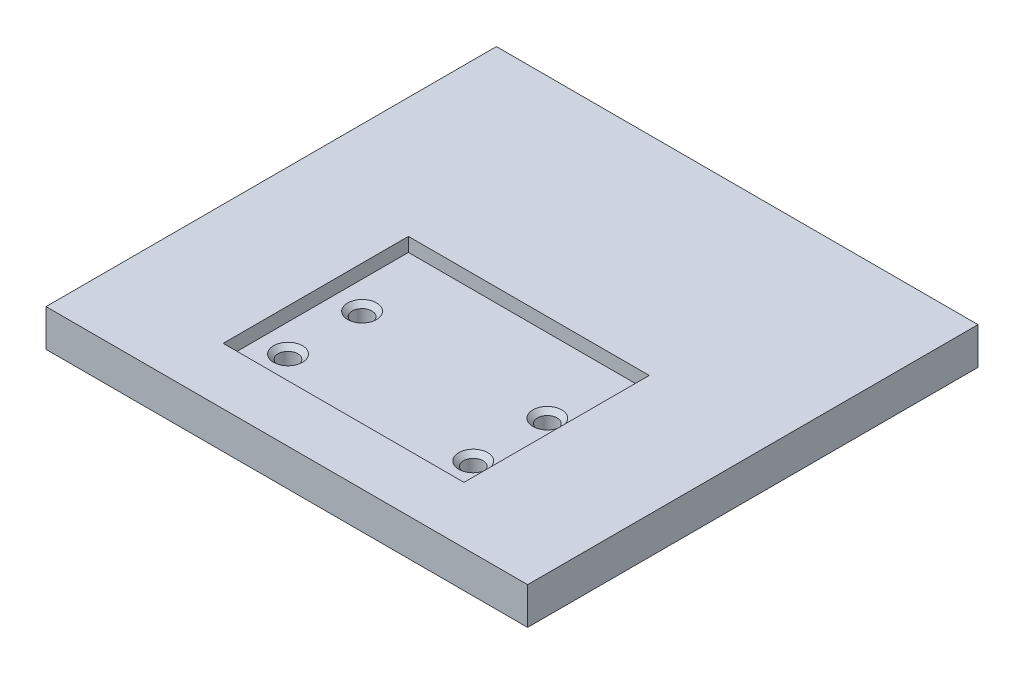
ISO-10303-21;
HEADER;
FILE_DESCRIPTION(('STEP AP214'),'2;1');
FILE_NAME('part.step','',(''),(''),'','','');
FILE_SCHEMA(('AUTOMOTIVE_DESIGN { 1 0 10303 214 1 1 1 1 }'));
ENDSEC;
DATA;
#1=APPLICATION_CONTEXT('core data for automotive mechanical design processes');
#2=APPLICATION_PROTOCOL_DEFINITION('international standard','automotive_design',2000,#1);
#3=PRODUCT_CONTEXT('',#1,'mechanical');
#4=PRODUCT('Part','Part','',(#3));
#5=PRODUCT_RELATED_PRODUCT_CATEGORY('part','',(#4));
#6=PRODUCT_DEFINITION_FORMATION('','',#4);
#7=PRODUCT_DEFINITION_CONTEXT('part definition',#1,'design');
#8=PRODUCT_DEFINITION('design','',#6,#7);
#9=PRODUCT_DEFINITION_SHAPE('','',#8);
#10=(LENGTH_UNIT() NAMED_UNIT(*) SI_UNIT(.MILLI.,.METRE.));
#11=(NAMED_UNIT(*) PLANE_ANGLE_UNIT() SI_UNIT($,.RADIAN.));
#12=(NAMED_UNIT(*) SI_UNIT($,.STERADIAN.) SOLID_ANGLE_UNIT());
#13=UNCERTAINTY_MEASURE_WITH_UNIT(LENGTH_MEASURE(1.E-05),#10,'distance_accuracy_value','');
#14=(GEOMETRIC_REPRESENTATION_CONTEXT(3) GLOBAL_UNCERTAINTY_ASSIGNED_CONTEXT((#13)) GLOBAL_UNIT_ASSIGNED_CONTEXT((#10,
#11,#12)) REPRESENTATION_CONTEXT('',''));
#15=CARTESIAN_POINT('',(0.,0.,0.));
#16=DIRECTION('',(0.,0.,1.));
#17=DIRECTION('',(1.,0.,0.));
#18=AXIS2_PLACEMENT_3D('',#15,#16,#17);
#19=CARTESIAN_POINT('',(0.,4.99999999999999,0.));
#20=DIRECTION('',(0.,1.,0.));
#21=DIRECTION('',(0.,0.,1.));
#22=AXIS2_PLACEMENT_3D('',#19,#20,#21);
#23=PLANE('',#22);
#24=CARTESIAN_POINT('',(20.,4.99999999999999,12.));
#25=DIRECTION('',(0.,1.,0.));
#26=DIRECTION('',(0.,0.,1.));
#27=AXIS2_PLACEMENT_3D('',#24,#25,#26);
#28=CIRCLE('',#27,3.11999999999998);
#29=CARTESIAN_POINT('',(20.,4.99999999999999,15.12));
#30=VERTEX_POINT('',#29);
#31=EDGE_CURVE('E59',#30,#30,#28,.F.);
#32=ORIENTED_EDGE('',*,*,#31,.T.);
#33=EDGE_LOOP('',(#32));
#34=FACE_BOUND('',#33,.T.);
#35=CARTESIAN_POINT('',(-20.,4.99999999999999,12.));
#36=DIRECTION('',(0.,1.,0.));
#37=DIRECTION('',(0.,0.,1.));
#38=AXIS2_PLACEMENT_3D('',#35,#36,#37);
#39=CIRCLE('',#38,3.11999999999998);
#40=CARTESIAN_POINT('',(-20.,4.99999999999999,15.12));
#41=VERTEX_POINT('',#40);
#42=EDGE_CURVE('E242',#41,#41,#39,.F.);
#43=ORIENTED_EDGE('',*,*,#42,.T.);
#44=EDGE_LOOP('',(#43));
#45=FACE_BOUND('',#44,.T.);
#46=CARTESIAN_POINT('',(-20.,4.99999999999999,-4.));
#47=DIRECTION('',(0.,1.,0.));
#48=DIRECTION('',(0.,0.,1.));
#49=AXIS2_PLACEMENT_3D('',#46,#47,#48);
#50=CIRCLE('',#49,3.12);
#51=CARTESIAN_POINT('',(-20.,4.99999999999999,-0.88));
#52=VERTEX_POINT('',#51);
#53=EDGE_CURVE('E234',#52,#52,#50,.F.);
#54=ORIENTED_EDGE('',*,*,#53,.T.);
#55=EDGE_LOOP('',(#54));
#56=FACE_BOUND('',#55,.T.);
#57=CARTESIAN_POINT('',(20.,4.99999999999999,-4.));
#58=DIRECTION('',(0.,1.,0.));
#59=DIRECTION('',(0.,0.,1.));
#60=AXIS2_PLACEMENT_3D('',#57,#58,#59);
#61=CIRCLE('',#60,3.12);
#62=CARTESIAN_POINT('',(20.,4.99999999999999,-0.879999999999992));
#63=VERTEX_POINT('',#62);
#64=EDGE_CURVE('E230',#63,#63,#61,.F.);
#65=ORIENTED_EDGE('',*,*,#64,.T.);
#66=EDGE_LOOP('',(#65));
#67=FACE_BOUND('',#66,.T.);
#68=DIRECTION('',(-1.,0.,0.));
#69=VECTOR('',#68,1.);
#70=CARTESIAN_POINT('',(0.,4.99999999999999,-20.));
#71=LINE('',#70,#69);
#72=CARTESIAN_POINT('',(26.,4.99999999999999,-20.));
#73=VERTEX_POINT('',#72);
#74=CARTESIAN_POINT('',(-26.,4.99999999999999,-20.));
#75=VERTEX_POINT('',#74);
#76=EDGE_CURVE('E217',#73,#75,#71,.T.);
#77=ORIENTED_EDGE('',*,*,#76,.T.);
#78=DIRECTION('',(0.,0.,1.));
#79=VECTOR('',#78,1.);
#80=CARTESIAN_POINT('',(-26.,4.99999999999999,0.));
#81=LINE('',#80,#79);
#82=CARTESIAN_POINT('',(-26.,4.99999999999999,20.));
#83=VERTEX_POINT('',#82);
#84=EDGE_CURVE('E71',#75,#83,#81,.T.);
#85=ORIENTED_EDGE('',*,*,#84,.T.);
#86=DIRECTION('',(1.,0.,0.));
#87=VECTOR('',#86,1.);
#88=CARTESIAN_POINT('',(0.,4.99999999999999,20.));
#89=LINE('',#88,#87);
#90=CARTESIAN_POINT('',(26.,4.99999999999999,20.));
#91=VERTEX_POINT('',#90);
#92=EDGE_CURVE('E121',#83,#91,#89,.T.);
#93=ORIENTED_EDGE('',*,*,#92,.T.);
#94=DIRECTION('',(0.,0.,1.));
#95=VECTOR('',#94,1.);
#96=CARTESIAN_POINT('',(26.,4.99999999999999,0.));
#97=LINE('',#96,#95);
#98=EDGE_CURVE('E66',#73,#91,#97,.T.);
#99=ORIENTED_EDGE('',*,*,#98,.F.);
#100=EDGE_LOOP('',(#77,#85,#93,#99));
#101=FACE_BOUND('',#100,.T.);
#102=ADVANCED_FACE('F49',(#34,#45,#56,#67,#101),#23,.T.);
#103=CARTESIAN_POINT('',(0.,0.,0.));
#104=DIRECTION('',(0.,1.,0.));
#105=DIRECTION('',(0.,0.,1.));
#106=AXIS2_PLACEMENT_3D('',#103,#104,#105);
#107=PLANE('',#106);
#108=CARTESIAN_POINT('',(-20.,0.,-4.));
#109=DIRECTION('',(0.,1.,0.));
#110=DIRECTION('',(0.,0.,1.));
#111=AXIS2_PLACEMENT_3D('',#108,#109,#110);
#112=CIRCLE('',#111,2.12);
#113=CARTESIAN_POINT('',(-20.,0.,-1.88));
#114=VERTEX_POINT('',#113);
#115=EDGE_CURVE('E193',#114,#114,#112,.T.);
#116=ORIENTED_EDGE('',*,*,#115,.T.);
#117=EDGE_LOOP('',(#116));
#118=FACE_BOUND('',#117,.T.);
#119=CARTESIAN_POINT('',(-20.,0.,12.));
#120=DIRECTION('',(0.,1.,0.));
#121=DIRECTION('',(0.,0.,1.));
#122=AXIS2_PLACEMENT_3D('',#119,#120,#121);
#123=CIRCLE('',#122,2.12);
#124=CARTESIAN_POINT('',(-20.,0.,14.12));
#125=VERTEX_POINT('',#124);
#126=EDGE_CURVE('E205',#125,#125,#123,.T.);
#127=ORIENTED_EDGE('',*,*,#126,.T.);
#128=EDGE_LOOP('',(#127));
#129=FACE_BOUND('',#128,.T.);
#130=CARTESIAN_POINT('',(20.,0.,12.));
#131=DIRECTION('',(0.,-1.,0.));
#132=DIRECTION('',(0.,0.,-1.));
#133=AXIS2_PLACEMENT_3D('',#130,#131,#132);
#134=CIRCLE('',#133,2.12);
#135=CARTESIAN_POINT('',(20.,0.,9.88));
#136=VERTEX_POINT('',#135);
#137=EDGE_CURVE('E209',#136,#136,#134,.T.);
#138=ORIENTED_EDGE('',*,*,#137,.F.);
#139=EDGE_LOOP('',(#138));
#140=FACE_BOUND('',#139,.T.);
#141=CARTESIAN_POINT('',(20.,0.,-4.));
#142=DIRECTION('',(0.,-1.,0.));
#143=DIRECTION('',(0.,0.,-1.));
#144=AXIS2_PLACEMENT_3D('',#141,#142,#143);
#145=CIRCLE('',#144,2.12);
#146=CARTESIAN_POINT('',(20.,0.,-6.12));
#147=VERTEX_POINT('',#146);
#148=EDGE_CURVE('E213',#147,#147,#145,.T.);
#149=ORIENTED_EDGE('',*,*,#148,.F.);
#150=EDGE_LOOP('',(#149));
#151=FACE_BOUND('',#150,.T.);
#152=DIRECTION('',(0.,0.,-1.));
#153=VECTOR('',#152,1.);
#154=CARTESIAN_POINT('',(-52.,0.,0.));
#155=LINE('',#154,#153);
#156=CARTESIAN_POINT('',(-52.,0.,32.2580909467664));
#157=VERTEX_POINT('',#156);
#158=CARTESIAN_POINT('',(-52.,0.,-65.));
#159=VERTEX_POINT('',#158);
#160=EDGE_CURVE('E166',#157,#159,#155,.T.);
#161=ORIENTED_EDGE('',*,*,#160,.T.);
#162=DIRECTION('',(1.,0.,0.));
#163=VECTOR('',#162,1.);
#164=CARTESIAN_POINT('',(0.,0.,-65.));
#165=LINE('',#164,#163);
#166=CARTESIAN_POINT('',(52.,0.,-65.));
#167=VERTEX_POINT('',#166);
#168=EDGE_CURVE('E138',#159,#167,#165,.T.);
#169=ORIENTED_EDGE('',*,*,#168,.T.);
#170=DIRECTION('',(0.,0.,-1.));
#171=VECTOR('',#170,1.);
#172=CARTESIAN_POINT('',(52.,0.,0.));
#173=LINE('',#172,#171);
#174=CARTESIAN_POINT('',(52.,0.,32.2580909467664));
#175=VERTEX_POINT('',#174);
#176=EDGE_CURVE('E174',#175,#167,#173,.T.);
#177=ORIENTED_EDGE('',*,*,#176,.F.);
#178=DIRECTION('',(1.,0.,0.));
#179=VECTOR('',#178,1.);
#180=CARTESIAN_POINT('',(0.,0.,32.2580909467664));
#181=LINE('',#180,#179);
#182=EDGE_CURVE('E170',#157,#175,#181,.T.);
#183=ORIENTED_EDGE('',*,*,#182,.F.);
#184=EDGE_LOOP('',(#161,#169,#177,#183));
#185=FACE_BOUND('',#184,.T.);
#186=ADVANCED_FACE('F270',(#118,#129,#140,#151,#185),#107,.F.);
#187=CARTESIAN_POINT('',(20.,6.99999999999999,-4.));
#188=DIRECTION('',(0.,-1.,0.));
#189=DIRECTION('',(0.,0.,-1.));
#190=AXIS2_PLACEMENT_3D('',#187,#188,#189);
#191=CYLINDRICAL_SURFACE('',#190,2.12);
#192=CARTESIAN_POINT('',(20.,4.,-4.));
#193=DIRECTION('',(0.,1.,0.));
#194=DIRECTION('',(0.,0.,1.));
#195=AXIS2_PLACEMENT_3D('',#192,#193,#194);
#196=CIRCLE('',#195,2.12);
#197=CARTESIAN_POINT('',(20.,4.,-1.88));
#198=VERTEX_POINT('',#197);
#199=EDGE_CURVE('E226',#198,#198,#196,.T.);
#200=ORIENTED_EDGE('',*,*,#199,.T.);
#201=EDGE_LOOP('',(#200));
#202=FACE_BOUND('',#201,.T.);
#203=ORIENTED_EDGE('',*,*,#148,.T.);
#204=EDGE_LOOP('',(#203));
#205=FACE_BOUND('',#204,.T.);
#206=ADVANCED_FACE('F275',(#202,#205),#191,.F.);
#207=CARTESIAN_POINT('',(20.,4.,-4.));
#208=DIRECTION('',(0.,1.,0.));
#209=DIRECTION('',(0.,0.,1.));
#210=AXIS2_PLACEMENT_3D('',#207,#208,#209);
#211=CONICAL_SURFACE('',#210,2.12,0.785398163397452);
#212=ORIENTED_EDGE('',*,*,#64,.F.);
#213=EDGE_LOOP('',(#212));
#214=FACE_BOUND('',#213,.T.);
#215=ORIENTED_EDGE('',*,*,#199,.F.);
#216=EDGE_LOOP('',(#215));
#217=FACE_BOUND('',#216,.T.);
#218=ADVANCED_FACE('F282',(#214,#217),#211,.F.);
#219=CARTESIAN_POINT('',(20.,4.99999999999999,12.));
#220=DIRECTION('',(0.,-1.,0.));
#221=DIRECTION('',(0.,0.,-1.));
#222=AXIS2_PLACEMENT_3D('',#219,#220,#221);
#223=CYLINDRICAL_SURFACE('',#222,2.12);
#224=CARTESIAN_POINT('',(20.,4.00000000000001,12.));
#225=DIRECTION('',(0.,1.,0.));
#226=DIRECTION('',(0.,0.,1.));
#227=AXIS2_PLACEMENT_3D('',#224,#225,#226);
#228=CIRCLE('',#227,2.12);
#229=CARTESIAN_POINT('',(20.,4.00000000000001,14.12));
#230=VERTEX_POINT('',#229);
#231=EDGE_CURVE('E11',#230,#230,#228,.T.);
#232=ORIENTED_EDGE('',*,*,#231,.T.);
#233=EDGE_LOOP('',(#232));
#234=FACE_BOUND('',#233,.T.);
#235=ORIENTED_EDGE('',*,*,#137,.T.);
#236=EDGE_LOOP('',(#235));
#237=FACE_BOUND('',#236,.T.);
#238=ADVANCED_FACE('F288',(#234,#237),#223,.F.);
#239=CARTESIAN_POINT('',(-20.,18.,12.));
#240=DIRECTION('',(0.,-1.,0.));
#241=DIRECTION('',(0.,0.,-1.));
#242=AXIS2_PLACEMENT_3D('',#239,#240,#241);
#243=CYLINDRICAL_SURFACE('',#242,2.12);
#244=CARTESIAN_POINT('',(-20.,4.00000000000001,12.));
#245=DIRECTION('',(0.,1.,0.));
#246=DIRECTION('',(0.,0.,1.));
#247=AXIS2_PLACEMENT_3D('',#244,#245,#246);
#248=CIRCLE('',#247,2.12);
#249=CARTESIAN_POINT('',(-20.,4.00000000000001,14.12));
#250=VERTEX_POINT('',#249);
#251=EDGE_CURVE('E246',#250,#250,#248,.T.);
#252=ORIENTED_EDGE('',*,*,#251,.T.);
#253=EDGE_LOOP('',(#252));
#254=FACE_BOUND('',#253,.T.);
#255=ORIENTED_EDGE('',*,*,#126,.F.);
#256=EDGE_LOOP('',(#255));
#257=FACE_BOUND('',#256,.T.);
#258=ADVANCED_FACE('F303',(#254,#257),#243,.F.);
#259=CARTESIAN_POINT('',(-20.,14.,-4.));
#260=DIRECTION('',(0.,-1.,0.));
#261=DIRECTION('',(0.,0.,-1.));
#262=AXIS2_PLACEMENT_3D('',#259,#260,#261);
#263=CYLINDRICAL_SURFACE('',#262,2.12);
#264=CARTESIAN_POINT('',(-20.,3.99999999999999,-4.));
#265=DIRECTION('',(0.,1.,0.));
#266=DIRECTION('',(0.,0.,1.));
#267=AXIS2_PLACEMENT_3D('',#264,#265,#266);
#268=CIRCLE('',#267,2.12);
#269=CARTESIAN_POINT('',(-20.,3.99999999999999,-1.88));
#270=VERTEX_POINT('',#269);
#271=EDGE_CURVE('E238',#270,#270,#268,.T.);
#272=ORIENTED_EDGE('',*,*,#271,.T.);
#273=EDGE_LOOP('',(#272));
#274=FACE_BOUND('',#273,.T.);
#275=ORIENTED_EDGE('',*,*,#115,.F.);
#276=EDGE_LOOP('',(#275));
#277=FACE_BOUND('',#276,.T.);
#278=ADVANCED_FACE('F294',(#274,#277),#263,.F.);
#279=CARTESIAN_POINT('',(-20.,4.99999999999999,-4.));
#280=DIRECTION('',(0.,1.,0.));
#281=DIRECTION('',(0.,0.,1.));
#282=AXIS2_PLACEMENT_3D('',#279,#280,#281);
#283=CONICAL_SURFACE('',#282,3.12,0.785398163397445);
#284=ORIENTED_EDGE('',*,*,#271,.F.);
#285=EDGE_LOOP('',(#284));
#286=FACE_BOUND('',#285,.T.);
#287=ORIENTED_EDGE('',*,*,#53,.F.);
#288=EDGE_LOOP('',(#287));
#289=FACE_BOUND('',#288,.T.);
#290=ADVANCED_FACE('F266',(#286,#289),#283,.F.);
#291=CARTESIAN_POINT('',(-20.,4.99999999999999,12.));
#292=DIRECTION('',(0.,1.,0.));
#293=DIRECTION('',(0.,0.,1.));
#294=AXIS2_PLACEMENT_3D('',#291,#292,#293);
#295=CONICAL_SURFACE('',#294,3.11999999999998,0.785398163397444);
#296=ORIENTED_EDGE('',*,*,#251,.F.);
#297=EDGE_LOOP('',(#296));
#298=FACE_BOUND('',#297,.T.);
#299=ORIENTED_EDGE('',*,*,#42,.F.);
#300=EDGE_LOOP('',(#299));
#301=FACE_BOUND('',#300,.T.);
#302=ADVANCED_FACE('F257',(#298,#301),#295,.F.);
#303=CARTESIAN_POINT('',(20.,4.99999999999999,12.));
#304=DIRECTION('',(0.,1.,0.));
#305=DIRECTION('',(0.,0.,1.));
#306=AXIS2_PLACEMENT_3D('',#303,#304,#305);
#307=CONICAL_SURFACE('',#306,3.11999999999998,0.785398163397445);
#308=ORIENTED_EDGE('',*,*,#231,.F.);
#309=EDGE_LOOP('',(#308));
#310=FACE_BOUND('',#309,.T.);
#311=ORIENTED_EDGE('',*,*,#31,.F.);
#312=EDGE_LOOP('',(#311));
#313=FACE_BOUND('',#312,.T.);
#314=ADVANCED_FACE('F52',(#310,#313),#307,.F.);
#315=CARTESIAN_POINT('',(-52.,8.,0.));
#316=DIRECTION('',(-1.,0.,0.));
#317=DIRECTION('',(0.,0.,1.));
#318=AXIS2_PLACEMENT_3D('',#315,#316,#317);
#319=PLANE('',#318);
#320=ORIENTED_EDGE('',*,*,#160,.F.);
#321=DIRECTION('',(0.,-1.,0.));
#322=VECTOR('',#321,1.);
#323=CARTESIAN_POINT('',(-52.,8.,32.2580909467664));
#324=LINE('',#323,#322);
#325=CARTESIAN_POINT('',(-52.,8.,32.2580909467664));
#326=VERTEX_POINT('',#325);
#327=EDGE_CURVE('E190',#326,#157,#324,.T.);
#328=ORIENTED_EDGE('',*,*,#327,.F.);
#329=DIRECTION('',(0.,0.,-1.));
#330=VECTOR('',#329,1.);
#331=CARTESIAN_POINT('',(-52.,8.,0.));
#332=LINE('',#331,#330);
#333=CARTESIAN_POINT('',(-52.,8.,-65.));
#334=VERTEX_POINT('',#333);
#335=EDGE_CURVE('E150',#326,#334,#332,.T.);
#336=ORIENTED_EDGE('',*,*,#335,.T.);
#337=DIRECTION('',(0.,-1.,0.));
#338=VECTOR('',#337,1.);
#339=CARTESIAN_POINT('',(-52.,8.,-65.));
#340=LINE('',#339,#338);
#341=EDGE_CURVE('E125',#334,#159,#340,.T.);
#342=ORIENTED_EDGE('',*,*,#341,.T.);
#343=EDGE_LOOP('',(#320,#328,#336,#342));
#344=FACE_BOUND('',#343,.T.);
#345=ADVANCED_FACE('F256',(#344),#319,.T.);
#346=CARTESIAN_POINT('',(0.,8.,32.2580909467664));
#347=DIRECTION('',(0.,0.,-1.));
#348=DIRECTION('',(-1.,0.,0.));
#349=AXIS2_PLACEMENT_3D('',#346,#347,#348);
#350=PLANE('',#349);
#351=ORIENTED_EDGE('',*,*,#182,.T.);
#352=DIRECTION('',(0.,-1.,0.));
#353=VECTOR('',#352,1.);
#354=CARTESIAN_POINT('',(52.,8.,32.2580909467664));
#355=LINE('',#354,#353);
#356=CARTESIAN_POINT('',(52.,8.,32.2580909467664));
#357=VERTEX_POINT('',#356);
#358=EDGE_CURVE('E186',#357,#175,#355,.T.);
#359=ORIENTED_EDGE('',*,*,#358,.F.);
#360=DIRECTION('',(1.,0.,0.));
#361=VECTOR('',#360,1.);
#362=CARTESIAN_POINT('',(0.,8.,32.2580909467664));
#363=LINE('',#362,#361);
#364=EDGE_CURVE('E154',#326,#357,#363,.T.);
#365=ORIENTED_EDGE('',*,*,#364,.F.);
#366=ORIENTED_EDGE('',*,*,#327,.T.);
#367=EDGE_LOOP('',(#351,#359,#365,#366));
#368=FACE_BOUND('',#367,.T.);
#369=ADVANCED_FACE('F263',(#368),#350,.F.);
#370=CARTESIAN_POINT('',(52.,8.,0.));
#371=DIRECTION('',(-1.,0.,0.));
#372=DIRECTION('',(0.,0.,1.));
#373=AXIS2_PLACEMENT_3D('',#370,#371,#372);
#374=PLANE('',#373);
#375=ORIENTED_EDGE('',*,*,#176,.T.);
#376=DIRECTION('',(0.,-1.,0.));
#377=VECTOR('',#376,1.);
#378=CARTESIAN_POINT('',(52.,8.,-65.));
#379=LINE('',#378,#377);
#380=CARTESIAN_POINT('',(52.,8.,-65.));
#381=VERTEX_POINT('',#380);
#382=EDGE_CURVE('E183',#381,#167,#379,.T.);
#383=ORIENTED_EDGE('',*,*,#382,.F.);
#384=DIRECTION('',(0.,0.,-1.));
#385=VECTOR('',#384,1.);
#386=CARTESIAN_POINT('',(52.,8.,0.));
#387=LINE('',#386,#385);
#388=EDGE_CURVE('E158',#357,#381,#387,.T.);
#389=ORIENTED_EDGE('',*,*,#388,.F.);
#390=ORIENTED_EDGE('',*,*,#358,.T.);
#391=EDGE_LOOP('',(#375,#383,#389,#390));
#392=FACE_BOUND('',#391,.T.);
#393=ADVANCED_FACE('F331',(#392),#374,.F.);
#394=CARTESIAN_POINT('',(0.,8.,20.));
#395=DIRECTION('',(0.,0.,-1.));
#396=DIRECTION('',(-1.,0.,0.));
#397=AXIS2_PLACEMENT_3D('',#394,#395,#396);
#398=PLANE('',#397);
#399=DIRECTION('',(0.,-1.,0.));
#400=VECTOR('',#399,1.);
#401=CARTESIAN_POINT('',(26.,8.,20.));
#402=LINE('',#401,#400);
#403=CARTESIAN_POINT('',(26.,8.,20.));
#404=VERTEX_POINT('',#403);
#405=EDGE_CURVE('E165',#404,#91,#402,.T.);
#406=ORIENTED_EDGE('',*,*,#405,.T.);
#407=ORIENTED_EDGE('',*,*,#92,.F.);
#408=DIRECTION('',(0.,-1.,0.));
#409=VECTOR('',#408,1.);
#410=CARTESIAN_POINT('',(-26.,8.,20.));
#411=LINE('',#410,#409);
#412=CARTESIAN_POINT('',(-26.,8.,20.));
#413=VERTEX_POINT('',#412);
#414=EDGE_CURVE('E115',#413,#83,#411,.T.);
#415=ORIENTED_EDGE('',*,*,#414,.F.);
#416=DIRECTION('',(1.,0.,0.));
#417=VECTOR('',#416,1.);
#418=CARTESIAN_POINT('',(0.,8.,20.));
#419=LINE('',#418,#417);
#420=EDGE_CURVE('E119',#413,#404,#419,.T.);
#421=ORIENTED_EDGE('',*,*,#420,.T.);
#422=EDGE_LOOP('',(#406,#407,#415,#421));
#423=FACE_BOUND('',#422,.T.);
#424=ADVANCED_FACE('F118',(#423),#398,.T.);
#425=CARTESIAN_POINT('',(-26.,8.,0.));
#426=DIRECTION('',(1.,0.,0.));
#427=DIRECTION('',(0.,0.,-1.));
#428=AXIS2_PLACEMENT_3D('',#425,#426,#427);
#429=PLANE('',#428);
#430=ORIENTED_EDGE('',*,*,#414,.T.);
#431=ORIENTED_EDGE('',*,*,#84,.F.);
#432=DIRECTION('',(0.,-1.,0.));
#433=VECTOR('',#432,1.);
#434=CARTESIAN_POINT('',(-26.,8.,-20.));
#435=LINE('',#434,#433);
#436=CARTESIAN_POINT('',(-26.,8.,-20.));
#437=VERTEX_POINT('',#436);
#438=EDGE_CURVE('E126',#437,#75,#435,.T.);
#439=ORIENTED_EDGE('',*,*,#438,.F.);
#440=DIRECTION('',(0.,0.,1.));
#441=VECTOR('',#440,1.);
#442=CARTESIAN_POINT('',(-26.,8.,0.));
#443=LINE('',#442,#441);
#444=EDGE_CURVE('E133',#437,#413,#443,.T.);
#445=ORIENTED_EDGE('',*,*,#444,.T.);
#446=EDGE_LOOP('',(#430,#431,#439,#445));
#447=FACE_BOUND('',#446,.T.);
#448=ADVANCED_FACE('F140',(#447),#429,.T.);
#449=CARTESIAN_POINT('',(0.,8.,-20.));
#450=DIRECTION('',(0.,0.,1.));
#451=DIRECTION('',(1.,0.,0.));
#452=AXIS2_PLACEMENT_3D('',#449,#450,#451);
#453=PLANE('',#452);
#454=ORIENTED_EDGE('',*,*,#438,.T.);
#455=ORIENTED_EDGE('',*,*,#76,.F.);
#456=DIRECTION('',(0.,-1.,0.));
#457=VECTOR('',#456,1.);
#458=CARTESIAN_POINT('',(26.,8.,-20.));
#459=LINE('',#458,#457);
#460=CARTESIAN_POINT('',(26.,8.,-20.));
#461=VERTEX_POINT('',#460);
#462=EDGE_CURVE('E196',#461,#73,#459,.T.);
#463=ORIENTED_EDGE('',*,*,#462,.F.);
#464=DIRECTION('',(-1.,0.,0.));
#465=VECTOR('',#464,1.);
#466=CARTESIAN_POINT('',(0.,8.,-20.));
#467=LINE('',#466,#465);
#468=EDGE_CURVE('E143',#461,#437,#467,.T.);
#469=ORIENTED_EDGE('',*,*,#468,.T.);
#470=EDGE_LOOP('',(#454,#455,#463,#469));
#471=FACE_BOUND('',#470,.T.);
#472=ADVANCED_FACE('F313',(#471),#453,.T.);
#473=CARTESIAN_POINT('',(26.,8.,0.));
#474=DIRECTION('',(-1.,0.,0.));
#475=DIRECTION('',(0.,0.,1.));
#476=AXIS2_PLACEMENT_3D('',#473,#474,#475);
#477=PLANE('',#476);
#478=ORIENTED_EDGE('',*,*,#462,.T.);
#479=ORIENTED_EDGE('',*,*,#98,.T.);
#480=ORIENTED_EDGE('',*,*,#405,.F.);
#481=DIRECTION('',(0.,0.,-1.));
#482=VECTOR('',#481,1.);
#483=CARTESIAN_POINT('',(26.,8.,0.));
#484=LINE('',#483,#482);
#485=EDGE_CURVE('E136',#404,#461,#484,.T.);
#486=ORIENTED_EDGE('',*,*,#485,.T.);
#487=EDGE_LOOP('',(#478,#479,#480,#486));
#488=FACE_BOUND('',#487,.T.);
#489=ADVANCED_FACE('F315',(#488),#477,.T.);
#490=CARTESIAN_POINT('',(0.,8.,-65.));
#491=DIRECTION('',(0.,0.,-1.));
#492=DIRECTION('',(-1.,0.,0.));
#493=AXIS2_PLACEMENT_3D('',#490,#491,#492);
#494=PLANE('',#493);
#495=ORIENTED_EDGE('',*,*,#168,.F.);
#496=ORIENTED_EDGE('',*,*,#341,.F.);
#497=DIRECTION('',(1.,0.,0.));
#498=VECTOR('',#497,1.);
#499=CARTESIAN_POINT('',(0.,8.,-65.));
#500=LINE('',#499,#498);
#501=EDGE_CURVE('E161',#334,#381,#500,.T.);
#502=ORIENTED_EDGE('',*,*,#501,.T.);
#503=ORIENTED_EDGE('',*,*,#382,.T.);
#504=EDGE_LOOP('',(#495,#496,#502,#503));
#505=FACE_BOUND('',#504,.T.);
#506=ADVANCED_FACE('F317',(#505),#494,.T.);
#507=CARTESIAN_POINT('',(0.,8.,0.));
#508=DIRECTION('',(0.,1.,0.));
#509=DIRECTION('',(0.,0.,1.));
#510=AXIS2_PLACEMENT_3D('',#507,#508,#509);
#511=PLANE('',#510);
#512=ORIENTED_EDGE('',*,*,#420,.F.);
#513=ORIENTED_EDGE('',*,*,#444,.F.);
#514=ORIENTED_EDGE('',*,*,#468,.F.);
#515=ORIENTED_EDGE('',*,*,#485,.F.);
#516=EDGE_LOOP('',(#512,#513,#514,#515));
#517=FACE_BOUND('',#516,.T.);
#518=ORIENTED_EDGE('',*,*,#335,.F.);
#519=ORIENTED_EDGE('',*,*,#364,.T.);
#520=ORIENTED_EDGE('',*,*,#388,.T.);
#521=ORIENTED_EDGE('',*,*,#501,.F.);
#522=EDGE_LOOP('',(#518,#519,#520,#521));
#523=FACE_BOUND('',#522,.T.);
#524=ADVANCED_FACE('F130',(#517,#523),#511,.T.);
#525=CLOSED_SHELL('',(#102,#186,#206,#218,#238,#258,#278,#290,#302,#314,#345,#369,#393,#424,
#448,#472,#489,#506,#524));
#526=MANIFOLD_SOLID_BREP('B2',#525);
#527=ADVANCED_BREP_SHAPE_REPRESENTATION('',(#18,#526),#14);
#528=SHAPE_DEFINITION_REPRESENTATION(#9,#527);
ENDSEC;
END-ISO-10303-21;
